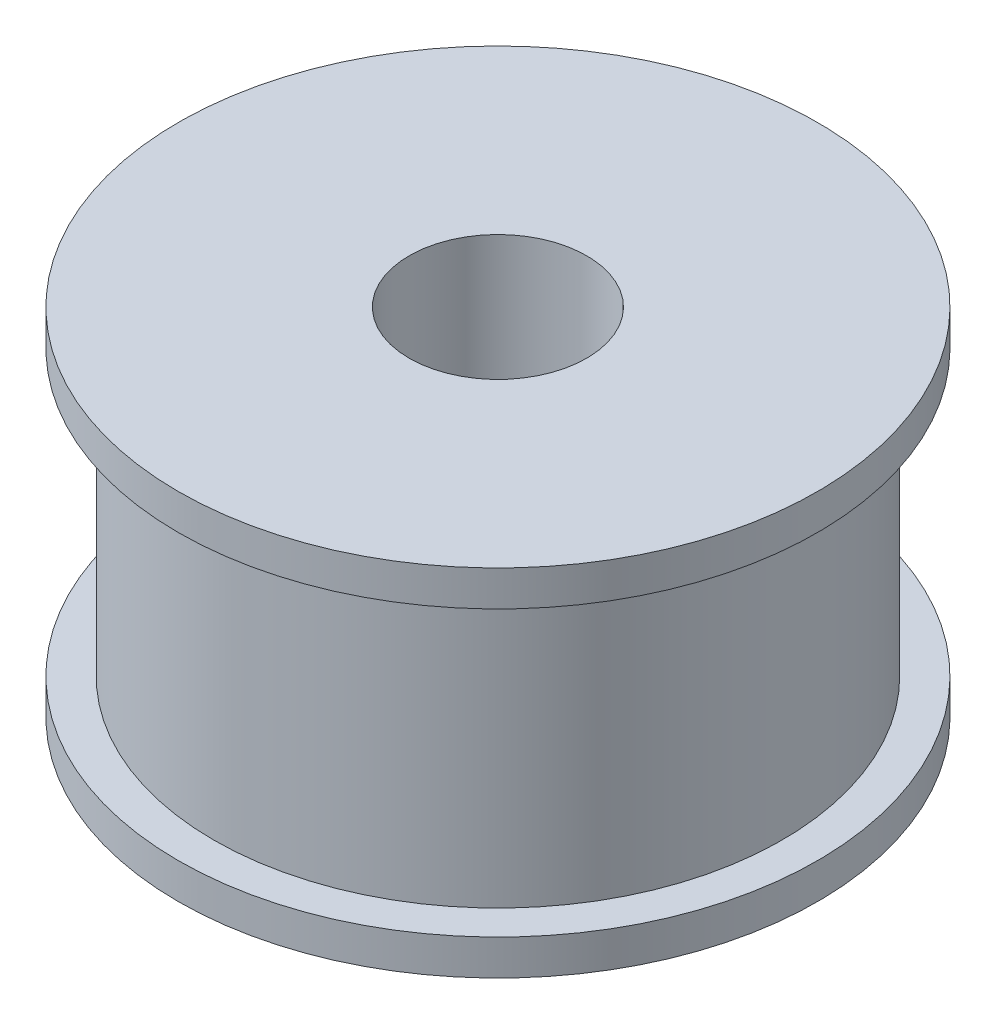
ISO-10303-21;
HEADER;
FILE_DESCRIPTION(('STEP AP214'),'2;1');
FILE_NAME('part.step','',(''),(''),'','','');
FILE_SCHEMA(('AUTOMOTIVE_DESIGN { 1 0 10303 214 1 1 1 1 }'));
ENDSEC;
DATA;
#1=APPLICATION_CONTEXT('core data for automotive mechanical design processes');
#2=APPLICATION_PROTOCOL_DEFINITION('international standard','automotive_design',2000,#1);
#3=PRODUCT_CONTEXT('',#1,'mechanical');
#4=PRODUCT('Part','Part','',(#3));
#5=PRODUCT_RELATED_PRODUCT_CATEGORY('part','',(#4));
#6=PRODUCT_DEFINITION_FORMATION('','',#4);
#7=PRODUCT_DEFINITION_CONTEXT('part definition',#1,'design');
#8=PRODUCT_DEFINITION('design','',#6,#7);
#9=PRODUCT_DEFINITION_SHAPE('','',#8);
#10=(LENGTH_UNIT() NAMED_UNIT(*) SI_UNIT(.MILLI.,.METRE.));
#11=(NAMED_UNIT(*) PLANE_ANGLE_UNIT() SI_UNIT($,.RADIAN.));
#12=(NAMED_UNIT(*) SI_UNIT($,.STERADIAN.) SOLID_ANGLE_UNIT());
#13=UNCERTAINTY_MEASURE_WITH_UNIT(LENGTH_MEASURE(1.E-05),#10,'distance_accuracy_value','');
#14=(GEOMETRIC_REPRESENTATION_CONTEXT(3) GLOBAL_UNCERTAINTY_ASSIGNED_CONTEXT((#13)) GLOBAL_UNIT_ASSIGNED_CONTEXT((#10,
#11,#12)) REPRESENTATION_CONTEXT('',''));
#15=CARTESIAN_POINT('',(0.,0.,0.));
#16=DIRECTION('',(0.,0.,1.));
#17=DIRECTION('',(1.,0.,0.));
#18=AXIS2_PLACEMENT_3D('',#15,#16,#17);
#19=CARTESIAN_POINT('',(0.,1.,0.));
#20=DIRECTION('',(0.,1.,0.));
#21=DIRECTION('',(0.,0.,1.));
#22=AXIS2_PLACEMENT_3D('',#19,#20,#21);
#23=PLANE('',#22);
#24=CARTESIAN_POINT('',(0.,1.,0.));
#25=DIRECTION('',(0.,1.,0.));
#26=DIRECTION('',(0.,0.,1.));
#27=AXIS2_PLACEMENT_3D('',#24,#25,#26);
#28=CIRCLE('',#27,8.);
#29=CARTESIAN_POINT('',(0.,1.,8.));
#30=VERTEX_POINT('',#29);
#31=EDGE_CURVE('E12',#30,#30,#28,.T.);
#32=ORIENTED_EDGE('',*,*,#31,.F.);
#33=EDGE_LOOP('',(#32));
#34=FACE_BOUND('',#33,.T.);
#35=CARTESIAN_POINT('',(0.,1.,0.));
#36=DIRECTION('',(0.,1.,0.));
#37=DIRECTION('',(0.,0.,1.));
#38=AXIS2_PLACEMENT_3D('',#35,#36,#37);
#39=CIRCLE('',#38,9.);
#40=CARTESIAN_POINT('',(0.,1.,9.));
#41=VERTEX_POINT('',#40);
#42=EDGE_CURVE('E52',#41,#41,#39,.T.);
#43=ORIENTED_EDGE('',*,*,#42,.T.);
#44=EDGE_LOOP('',(#43));
#45=FACE_BOUND('',#44,.T.);
#46=ADVANCED_FACE('F44',(#34,#45),#23,.T.);
#47=CARTESIAN_POINT('',(0.,0.,0.));
#48=DIRECTION('',(0.,1.,0.));
#49=DIRECTION('',(0.,0.,1.));
#50=AXIS2_PLACEMENT_3D('',#47,#48,#49);
#51=PLANE('',#50);
#52=CARTESIAN_POINT('',(0.,0.,0.));
#53=DIRECTION('',(0.,1.,0.));
#54=DIRECTION('',(0.,0.,1.));
#55=AXIS2_PLACEMENT_3D('',#52,#53,#54);
#56=CIRCLE('',#55,9.);
#57=CARTESIAN_POINT('',(0.,0.,9.));
#58=VERTEX_POINT('',#57);
#59=EDGE_CURVE('E48',#58,#58,#56,.T.);
#60=ORIENTED_EDGE('',*,*,#59,.F.);
#61=EDGE_LOOP('',(#60));
#62=FACE_BOUND('',#61,.T.);
#63=CARTESIAN_POINT('',(0.,0.,0.));
#64=DIRECTION('',(0.,1.,0.));
#65=DIRECTION('',(0.,0.,1.));
#66=AXIS2_PLACEMENT_3D('',#63,#64,#65);
#67=CIRCLE('',#66,2.5);
#68=CARTESIAN_POINT('',(0.,0.,2.5));
#69=VERTEX_POINT('',#68);
#70=EDGE_CURVE('E61',#69,#69,#67,.T.);
#71=ORIENTED_EDGE('',*,*,#70,.T.);
#72=EDGE_LOOP('',(#71));
#73=FACE_BOUND('',#72,.T.);
#74=ADVANCED_FACE('F97',(#62,#73),#51,.F.);
#75=CARTESIAN_POINT('',(0.,1.,0.));
#76=DIRECTION('',(0.,-1.,0.));
#77=DIRECTION('',(0.,0.,-1.));
#78=AXIS2_PLACEMENT_3D('',#75,#76,#77);
#79=CYLINDRICAL_SURFACE('',#78,9.);
#80=ORIENTED_EDGE('',*,*,#42,.F.);
#81=EDGE_LOOP('',(#80));
#82=FACE_BOUND('',#81,.T.);
#83=ORIENTED_EDGE('',*,*,#59,.T.);
#84=EDGE_LOOP('',(#83));
#85=FACE_BOUND('',#84,.T.);
#86=ADVANCED_FACE('F46',(#82,#85),#79,.T.);
#87=CARTESIAN_POINT('',(0.,1.,0.));
#88=DIRECTION('',(0.,-1.,0.));
#89=DIRECTION('',(0.,0.,-1.));
#90=AXIS2_PLACEMENT_3D('',#87,#88,#89);
#91=CYLINDRICAL_SURFACE('',#90,2.5);
#92=ORIENTED_EDGE('',*,*,#70,.F.);
#93=EDGE_LOOP('',(#92));
#94=FACE_BOUND('',#93,.T.);
#95=CARTESIAN_POINT('',(0.,10.,0.));
#96=DIRECTION('',(0.,1.,0.));
#97=DIRECTION('',(0.,0.,1.));
#98=AXIS2_PLACEMENT_3D('',#95,#96,#97);
#99=CIRCLE('',#98,2.5);
#100=CARTESIAN_POINT('',(0.,10.,2.5));
#101=VERTEX_POINT('',#100);
#102=EDGE_CURVE('E76',#101,#101,#99,.T.);
#103=ORIENTED_EDGE('',*,*,#102,.T.);
#104=EDGE_LOOP('',(#103));
#105=FACE_BOUND('',#104,.T.);
#106=ADVANCED_FACE('F81',(#94,#105),#91,.F.);
#107=CARTESIAN_POINT('',(0.,9.,0.));
#108=DIRECTION('',(0.,-1.,0.));
#109=DIRECTION('',(0.,0.,-1.));
#110=AXIS2_PLACEMENT_3D('',#107,#108,#109);
#111=CYLINDRICAL_SURFACE('',#110,8.);
#112=CARTESIAN_POINT('',(0.,9.,0.));
#113=DIRECTION('',(0.,1.,0.));
#114=DIRECTION('',(0.,0.,1.));
#115=AXIS2_PLACEMENT_3D('',#112,#113,#114);
#116=CIRCLE('',#115,8.);
#117=CARTESIAN_POINT('',(0.,9.,8.));
#118=VERTEX_POINT('',#117);
#119=EDGE_CURVE('E59',#118,#118,#116,.T.);
#120=ORIENTED_EDGE('',*,*,#119,.F.);
#121=EDGE_LOOP('',(#120));
#122=FACE_BOUND('',#121,.T.);
#123=ORIENTED_EDGE('',*,*,#31,.T.);
#124=EDGE_LOOP('',(#123));
#125=FACE_BOUND('',#124,.T.);
#126=ADVANCED_FACE('F86',(#122,#125),#111,.T.);
#127=CARTESIAN_POINT('',(0.,10.,0.));
#128=DIRECTION('',(0.,1.,0.));
#129=DIRECTION('',(0.,0.,1.));
#130=AXIS2_PLACEMENT_3D('',#127,#128,#129);
#131=PLANE('',#130);
#132=CARTESIAN_POINT('',(0.,10.,0.));
#133=DIRECTION('',(0.,1.,0.));
#134=DIRECTION('',(0.,0.,1.));
#135=AXIS2_PLACEMENT_3D('',#132,#133,#134);
#136=CIRCLE('',#135,9.);
#137=CARTESIAN_POINT('',(0.,10.,9.));
#138=VERTEX_POINT('',#137);
#139=EDGE_CURVE('E67',#138,#138,#136,.T.);
#140=ORIENTED_EDGE('',*,*,#139,.T.);
#141=EDGE_LOOP('',(#140));
#142=FACE_BOUND('',#141,.T.);
#143=ORIENTED_EDGE('',*,*,#102,.F.);
#144=EDGE_LOOP('',(#143));
#145=FACE_BOUND('',#144,.T.);
#146=ADVANCED_FACE('F83',(#142,#145),#131,.T.);
#147=CARTESIAN_POINT('',(0.,9.,0.));
#148=DIRECTION('',(0.,1.,0.));
#149=DIRECTION('',(0.,0.,1.));
#150=AXIS2_PLACEMENT_3D('',#147,#148,#149);
#151=PLANE('',#150);
#152=ORIENTED_EDGE('',*,*,#119,.T.);
#153=EDGE_LOOP('',(#152));
#154=FACE_BOUND('',#153,.T.);
#155=CARTESIAN_POINT('',(0.,9.,0.));
#156=DIRECTION('',(0.,1.,0.));
#157=DIRECTION('',(0.,0.,1.));
#158=AXIS2_PLACEMENT_3D('',#155,#156,#157);
#159=CIRCLE('',#158,9.);
#160=CARTESIAN_POINT('',(0.,9.,9.));
#161=VERTEX_POINT('',#160);
#162=EDGE_CURVE('E71',#161,#161,#159,.T.);
#163=ORIENTED_EDGE('',*,*,#162,.F.);
#164=EDGE_LOOP('',(#163));
#165=FACE_BOUND('',#164,.T.);
#166=ADVANCED_FACE('F85',(#154,#165),#151,.F.);
#167=CARTESIAN_POINT('',(0.,10.,0.));
#168=DIRECTION('',(0.,-1.,0.));
#169=DIRECTION('',(0.,0.,-1.));
#170=AXIS2_PLACEMENT_3D('',#167,#168,#169);
#171=CYLINDRICAL_SURFACE('',#170,9.);
#172=ORIENTED_EDGE('',*,*,#139,.F.);
#173=EDGE_LOOP('',(#172));
#174=FACE_BOUND('',#173,.T.);
#175=ORIENTED_EDGE('',*,*,#162,.T.);
#176=EDGE_LOOP('',(#175));
#177=FACE_BOUND('',#176,.T.);
#178=ADVANCED_FACE('F92',(#174,#177),#171,.T.);
#179=CLOSED_SHELL('',(#46,#74,#86,#106,#126,#146,#166,#178));
#180=MANIFOLD_SOLID_BREP('B2',#179);
#181=ADVANCED_BREP_SHAPE_REPRESENTATION('',(#18,#180),#14);
#182=SHAPE_DEFINITION_REPRESENTATION(#9,#181);
ENDSEC;
END-ISO-10303-21;
